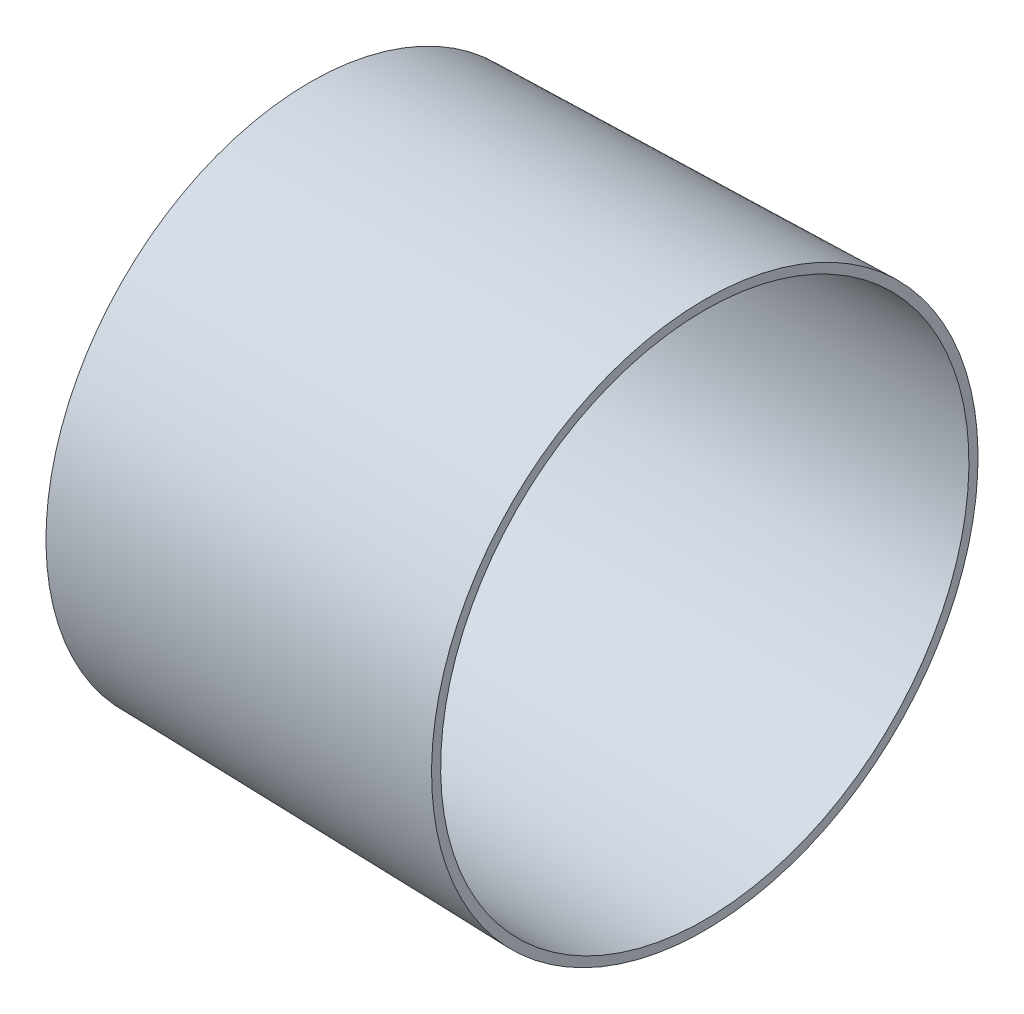
ISO-10303-21;
HEADER;
FILE_DESCRIPTION(('STEP AP214'),'2;1');
FILE_NAME('part.step','',(''),(''),'','','');
FILE_SCHEMA(('AUTOMOTIVE_DESIGN { 1 0 10303 214 1 1 1 1 }'));
ENDSEC;
DATA;
#1=APPLICATION_CONTEXT('core data for automotive mechanical design processes');
#2=APPLICATION_PROTOCOL_DEFINITION('international standard','automotive_design',2000,#1);
#3=PRODUCT_CONTEXT('',#1,'mechanical');
#4=PRODUCT('Part','Part','',(#3));
#5=PRODUCT_RELATED_PRODUCT_CATEGORY('part','',(#4));
#6=PRODUCT_DEFINITION_FORMATION('','',#4);
#7=PRODUCT_DEFINITION_CONTEXT('part definition',#1,'design');
#8=PRODUCT_DEFINITION('design','',#6,#7);
#9=PRODUCT_DEFINITION_SHAPE('','',#8);
#10=(LENGTH_UNIT() NAMED_UNIT(*) SI_UNIT(.MILLI.,.METRE.));
#11=(NAMED_UNIT(*) PLANE_ANGLE_UNIT() SI_UNIT($,.RADIAN.));
#12=(NAMED_UNIT(*) SI_UNIT($,.STERADIAN.) SOLID_ANGLE_UNIT());
#13=UNCERTAINTY_MEASURE_WITH_UNIT(LENGTH_MEASURE(1.E-05),#10,'distance_accuracy_value','');
#14=(GEOMETRIC_REPRESENTATION_CONTEXT(3) GLOBAL_UNCERTAINTY_ASSIGNED_CONTEXT((#13)) GLOBAL_UNIT_ASSIGNED_CONTEXT((#10,
#11,#12)) REPRESENTATION_CONTEXT('',''));
#15=CARTESIAN_POINT('',(0.,0.,0.));
#16=DIRECTION('',(0.,0.,1.));
#17=DIRECTION('',(1.,0.,0.));
#18=AXIS2_PLACEMENT_3D('',#15,#16,#17);
#19=CARTESIAN_POINT('',(3700.,0.,0.));
#20=DIRECTION('',(1.,0.,0.));
#21=DIRECTION('',(0.,0.,-1.));
#22=AXIS2_PLACEMENT_3D('',#19,#20,#21);
#23=CONICAL_SURFACE('',#22,420.,0.023072827890144);
#24=CARTESIAN_POINT('',(3700.,0.,0.));
#25=DIRECTION('',(-1.,0.,0.));
#26=DIRECTION('',(0.,0.,1.));
#27=AXIS2_PLACEMENT_3D('',#24,#25,#26);
#28=CIRCLE('',#27,420.);
#29=CARTESIAN_POINT('',(3700.,420.,-3.01542614506695E-06));
#30=VERTEX_POINT('',#29);
#31=CARTESIAN_POINT('',(3700.,420.,0.));
#32=VERTEX_POINT('',#31);
#33=EDGE_CURVE('E11',#30,#32,#28,.T.);
#34=ORIENTED_EDGE('',*,*,#33,.T.);
#35=DIRECTION('',(0.999733834114794,0.0230707807872645,0.));
#36=VECTOR('',#35,1.);
#37=CARTESIAN_POINT('',(4350.,435.,0.));
#38=LINE('',#37,#36);
#39=CARTESIAN_POINT('',(4350.,435.,0.));
#40=VERTEX_POINT('',#39);
#41=EDGE_CURVE('E100',#32,#40,#38,.T.);
#42=ORIENTED_EDGE('',*,*,#41,.T.);
#43=CARTESIAN_POINT('',(4350.,0.,0.));
#44=DIRECTION('',(-1.,0.,0.));
#45=DIRECTION('',(0.,0.,1.));
#46=AXIS2_PLACEMENT_3D('',#43,#44,#45);
#47=CIRCLE('',#46,435.);
#48=CARTESIAN_POINT('',(4350.,435.,-3.1231199359622E-06));
#49=VERTEX_POINT('',#48);
#50=EDGE_CURVE('E80',#49,#40,#47,.T.);
#51=ORIENTED_EDGE('',*,*,#50,.F.);
#52=DIRECTION('',(0.999733834114794,0.0230707807872645,-1.65638656126252E-10));
#53=VECTOR('',#52,1.);
#54=CARTESIAN_POINT('',(4350.,435.,-3.1231199359622E-06));
#55=LINE('',#54,#53);
#56=EDGE_CURVE('E103',#30,#49,#55,.T.);
#57=ORIENTED_EDGE('',*,*,#56,.F.);
#58=EDGE_LOOP('',(#34,#42,#51,#57));
#59=FACE_BOUND('',#58,.T.);
#60=ADVANCED_FACE('F39',(#59),#23,.F.);
#61=CARTESIAN_POINT('',(3700.,420.,-3.01542614506695E-06));
#62=DIRECTION('',(1.,0.,0.));
#63=DIRECTION('',(0.,0.,-1.));
#64=AXIS2_PLACEMENT_3D('',#61,#62,#63);
#65=PLANE('',#64);
#66=CARTESIAN_POINT('',(3700.,0.,0.));
#67=DIRECTION('',(-1.,0.,0.));
#68=DIRECTION('',(0.,0.,1.));
#69=AXIS2_PLACEMENT_3D('',#66,#67,#68);
#70=CIRCLE('',#69,435.);
#71=CARTESIAN_POINT('',(3700.,435.,-3.1231199359622E-06));
#72=VERTEX_POINT('',#71);
#73=CARTESIAN_POINT('',(3700.,435.,0.));
#74=VERTEX_POINT('',#73);
#75=EDGE_CURVE('E50',#72,#74,#70,.T.);
#76=ORIENTED_EDGE('',*,*,#75,.T.);
#77=DIRECTION('',(0.,-1.,0.));
#78=VECTOR('',#77,1.);
#79=CARTESIAN_POINT('',(3700.,420.,0.));
#80=LINE('',#79,#78);
#81=EDGE_CURVE('E104',#74,#32,#80,.T.);
#82=ORIENTED_EDGE('',*,*,#81,.T.);
#83=ORIENTED_EDGE('',*,*,#33,.F.);
#84=DIRECTION('',(0.,-1.,7.17958605968322E-09));
#85=VECTOR('',#84,1.);
#86=CARTESIAN_POINT('',(3700.,420.,-3.01542614506695E-06));
#87=LINE('',#86,#85);
#88=EDGE_CURVE('E91',#72,#30,#87,.T.);
#89=ORIENTED_EDGE('',*,*,#88,.F.);
#90=EDGE_LOOP('',(#76,#82,#83,#89));
#91=FACE_BOUND('',#90,.T.);
#92=ADVANCED_FACE('F41',(#91),#65,.F.);
#93=CARTESIAN_POINT('',(4350.,0.,0.));
#94=DIRECTION('',(1.,0.,0.));
#95=DIRECTION('',(0.,0.,-1.));
#96=AXIS2_PLACEMENT_3D('',#93,#94,#95);
#97=CONICAL_SURFACE('',#96,450.,0.023072827890144);
#98=CARTESIAN_POINT('',(4350.,0.,0.));
#99=DIRECTION('',(-1.,0.,0.));
#100=DIRECTION('',(0.,0.,1.));
#101=AXIS2_PLACEMENT_3D('',#98,#99,#100);
#102=CIRCLE('',#101,450.);
#103=CARTESIAN_POINT('',(4350.,450.,-3.23081372685745E-06));
#104=VERTEX_POINT('',#103);
#105=CARTESIAN_POINT('',(4350.,450.,0.));
#106=VERTEX_POINT('',#105);
#107=EDGE_CURVE('E89',#104,#106,#102,.T.);
#108=ORIENTED_EDGE('',*,*,#107,.T.);
#109=DIRECTION('',(-0.999733834114794,-0.0230707807872645,0.));
#110=VECTOR('',#109,1.);
#111=CARTESIAN_POINT('',(3700.,435.,0.));
#112=LINE('',#111,#110);
#113=EDGE_CURVE('E97',#106,#74,#112,.T.);
#114=ORIENTED_EDGE('',*,*,#113,.T.);
#115=ORIENTED_EDGE('',*,*,#75,.F.);
#116=DIRECTION('',(-0.999733834114794,-0.0230707807872645,1.65638656126252E-10));
#117=VECTOR('',#116,1.);
#118=CARTESIAN_POINT('',(3700.,435.,-3.1231199359622E-06));
#119=LINE('',#118,#117);
#120=EDGE_CURVE('E109',#104,#72,#119,.T.);
#121=ORIENTED_EDGE('',*,*,#120,.F.);
#122=EDGE_LOOP('',(#108,#114,#115,#121));
#123=FACE_BOUND('',#122,.T.);
#124=ADVANCED_FACE('F112',(#123),#97,.T.);
#125=CARTESIAN_POINT('',(4350.,450.,-3.23081372685745E-06));
#126=DIRECTION('',(-1.,0.,0.));
#127=DIRECTION('',(0.,0.,1.));
#128=AXIS2_PLACEMENT_3D('',#125,#126,#127);
#129=PLANE('',#128);
#130=DIRECTION('',(0.,1.,-7.17958605968322E-09));
#131=VECTOR('',#130,1.);
#132=CARTESIAN_POINT('',(4350.,450.,-3.23081372685745E-06));
#133=LINE('',#132,#131);
#134=EDGE_CURVE('E82',#49,#104,#133,.T.);
#135=ORIENTED_EDGE('',*,*,#134,.F.);
#136=ORIENTED_EDGE('',*,*,#50,.T.);
#137=DIRECTION('',(0.,1.,0.));
#138=VECTOR('',#137,1.);
#139=CARTESIAN_POINT('',(4350.,450.,0.));
#140=LINE('',#139,#138);
#141=EDGE_CURVE('E85',#40,#106,#140,.T.);
#142=ORIENTED_EDGE('',*,*,#141,.T.);
#143=ORIENTED_EDGE('',*,*,#107,.F.);
#144=EDGE_LOOP('',(#135,#136,#142,#143));
#145=FACE_BOUND('',#144,.T.);
#146=ADVANCED_FACE('F83',(#145),#129,.F.);
#147=CARTESIAN_POINT('',(0.,0.,0.));
#148=DIRECTION('',(0.,-7.17958605968322E-09,-1.));
#149=DIRECTION('',(-1.,0.,0.));
#150=AXIS2_PLACEMENT_3D('',#147,#148,#149);
#151=PLANE('',#150);
#152=ORIENTED_EDGE('',*,*,#56,.T.);
#153=ORIENTED_EDGE('',*,*,#134,.T.);
#154=ORIENTED_EDGE('',*,*,#120,.T.);
#155=ORIENTED_EDGE('',*,*,#88,.T.);
#156=EDGE_LOOP('',(#152,#153,#154,#155));
#157=FACE_BOUND('',#156,.T.);
#158=ADVANCED_FACE('F111',(#157),#151,.F.);
#159=CARTESIAN_POINT('',(0.,0.,0.));
#160=DIRECTION('',(0.,0.,-1.));
#161=DIRECTION('',(-1.,0.,0.));
#162=AXIS2_PLACEMENT_3D('',#159,#160,#161);
#163=PLANE('',#162);
#164=ORIENTED_EDGE('',*,*,#41,.F.);
#165=ORIENTED_EDGE('',*,*,#81,.F.);
#166=ORIENTED_EDGE('',*,*,#113,.F.);
#167=ORIENTED_EDGE('',*,*,#141,.F.);
#168=EDGE_LOOP('',(#164,#165,#166,#167));
#169=FACE_BOUND('',#168,.T.);
#170=ADVANCED_FACE('F94',(#169),#163,.T.);
#171=CLOSED_SHELL('',(#60,#92,#124,#146,#158,#170));
#172=MANIFOLD_SOLID_BREP('B2',#171);
#173=ADVANCED_BREP_SHAPE_REPRESENTATION('',(#18,#172),#14);
#174=SHAPE_DEFINITION_REPRESENTATION(#9,#173);
ENDSEC;
END-ISO-10303-21;
